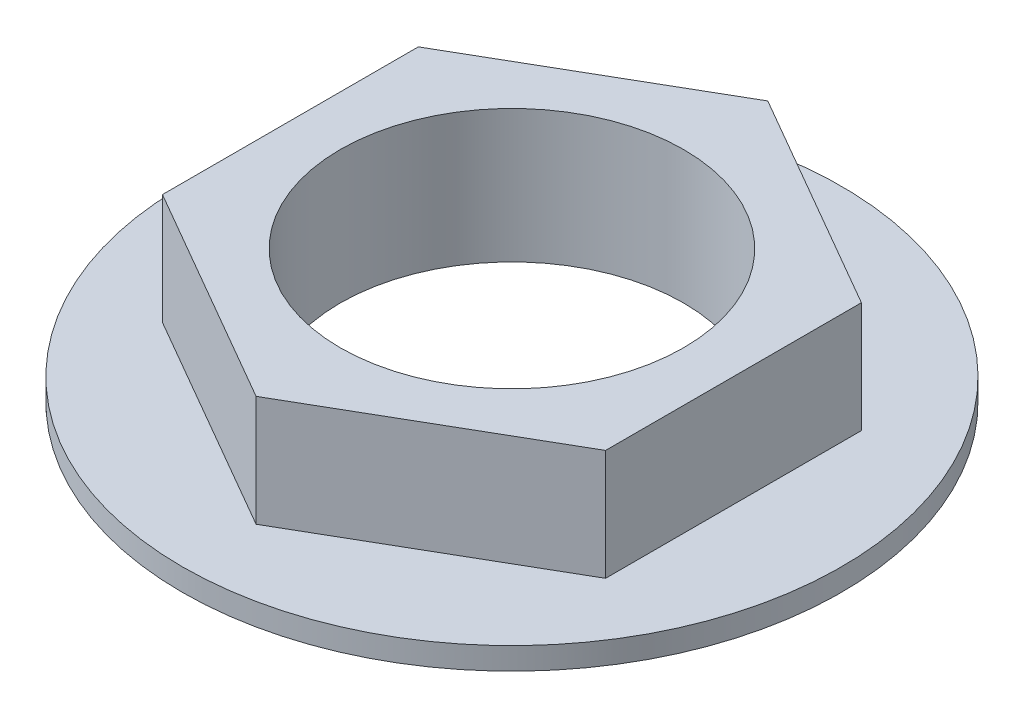
ISO-10303-21;
HEADER;
FILE_DESCRIPTION(('STEP AP214'),'2;1');
FILE_NAME('part.step','',(''),(''),'','','');
FILE_SCHEMA(('AUTOMOTIVE_DESIGN { 1 0 10303 214 1 1 1 1 }'));
ENDSEC;
DATA;
#1=APPLICATION_CONTEXT('core data for automotive mechanical design processes');
#2=APPLICATION_PROTOCOL_DEFINITION('international standard','automotive_design',2000,#1);
#3=PRODUCT_CONTEXT('',#1,'mechanical');
#4=PRODUCT('Part','Part','',(#3));
#5=PRODUCT_RELATED_PRODUCT_CATEGORY('part','',(#4));
#6=PRODUCT_DEFINITION_FORMATION('','',#4);
#7=PRODUCT_DEFINITION_CONTEXT('part definition',#1,'design');
#8=PRODUCT_DEFINITION('design','',#6,#7);
#9=PRODUCT_DEFINITION_SHAPE('','',#8);
#10=(LENGTH_UNIT() NAMED_UNIT(*) SI_UNIT(.MILLI.,.METRE.));
#11=(NAMED_UNIT(*) PLANE_ANGLE_UNIT() SI_UNIT($,.RADIAN.));
#12=(NAMED_UNIT(*) SI_UNIT($,.STERADIAN.) SOLID_ANGLE_UNIT());
#13=UNCERTAINTY_MEASURE_WITH_UNIT(LENGTH_MEASURE(1.E-05),#10,'distance_accuracy_value','');
#14=(GEOMETRIC_REPRESENTATION_CONTEXT(3) GLOBAL_UNCERTAINTY_ASSIGNED_CONTEXT((#13)) GLOBAL_UNIT_ASSIGNED_CONTEXT((#10,
#11,#12)) REPRESENTATION_CONTEXT('',''));
#15=CARTESIAN_POINT('',(0.,0.,0.));
#16=DIRECTION('',(0.,0.,1.));
#17=DIRECTION('',(1.,0.,0.));
#18=AXIS2_PLACEMENT_3D('',#15,#16,#17);
#19=CARTESIAN_POINT('',(0.,0.,0.));
#20=DIRECTION('',(0.,1.,0.));
#21=DIRECTION('',(0.,0.,1.));
#22=AXIS2_PLACEMENT_3D('',#19,#20,#21);
#23=PLANE('',#22);
#24=CARTESIAN_POINT('',(0.,0.,0.));
#25=DIRECTION('',(0.,1.,0.));
#26=DIRECTION('',(0.,0.,1.));
#27=AXIS2_PLACEMENT_3D('',#24,#25,#26);
#28=CIRCLE('',#27,5.95);
#29=CARTESIAN_POINT('',(0.,0.,5.95));
#30=VERTEX_POINT('',#29);
#31=EDGE_CURVE('E37',#30,#30,#28,.T.);
#32=ORIENTED_EDGE('',*,*,#31,.T.);
#33=EDGE_LOOP('',(#32));
#34=FACE_BOUND('',#33,.T.);
#35=DIRECTION('',(0.866025403784438,0.,0.5));
#36=VECTOR('',#35,1.);
#37=CARTESIAN_POINT('',(-4.,0.,2.3094010767585));
#38=LINE('',#37,#36);
#39=CARTESIAN_POINT('',(-4.,0.,2.3094010767585));
#40=VERTEX_POINT('',#39);
#41=CARTESIAN_POINT('',(0.,0.,4.61880215351701));
#42=VERTEX_POINT('',#41);
#43=EDGE_CURVE('E121',#40,#42,#38,.T.);
#44=ORIENTED_EDGE('',*,*,#43,.F.);
#45=DIRECTION('',(0.,0.,1.));
#46=VECTOR('',#45,1.);
#47=CARTESIAN_POINT('',(-4.,0.,-2.3094010767585));
#48=LINE('',#47,#46);
#49=CARTESIAN_POINT('',(-4.,0.,-2.3094010767585));
#50=VERTEX_POINT('',#49);
#51=EDGE_CURVE('E118',#50,#40,#48,.T.);
#52=ORIENTED_EDGE('',*,*,#51,.F.);
#53=DIRECTION('',(-0.866025403784439,0.,0.5));
#54=VECTOR('',#53,1.);
#55=CARTESIAN_POINT('',(0.,0.,-4.61880215351701));
#56=LINE('',#55,#54);
#57=CARTESIAN_POINT('',(0.,0.,-4.61880215351701));
#58=VERTEX_POINT('',#57);
#59=EDGE_CURVE('E76',#58,#50,#56,.T.);
#60=ORIENTED_EDGE('',*,*,#59,.F.);
#61=DIRECTION('',(-0.866025403784439,0.,-0.5));
#62=VECTOR('',#61,1.);
#63=CARTESIAN_POINT('',(4.,0.,-2.30940107675851));
#64=LINE('',#63,#62);
#65=CARTESIAN_POINT('',(4.,0.,-2.30940107675851));
#66=VERTEX_POINT('',#65);
#67=EDGE_CURVE('E127',#66,#58,#64,.T.);
#68=ORIENTED_EDGE('',*,*,#67,.F.);
#69=DIRECTION('',(0.,0.,-1.));
#70=VECTOR('',#69,1.);
#71=CARTESIAN_POINT('',(4.,0.,2.3094010767585));
#72=LINE('',#71,#70);
#73=CARTESIAN_POINT('',(4.,0.,2.3094010767585));
#74=VERTEX_POINT('',#73);
#75=EDGE_CURVE('E107',#74,#66,#72,.T.);
#76=ORIENTED_EDGE('',*,*,#75,.F.);
#77=DIRECTION('',(0.866025403784439,0.,-0.5));
#78=VECTOR('',#77,1.);
#79=CARTESIAN_POINT('',(0.,0.,4.61880215351701));
#80=LINE('',#79,#78);
#81=EDGE_CURVE('E124',#42,#74,#80,.T.);
#82=ORIENTED_EDGE('',*,*,#81,.F.);
#83=EDGE_LOOP('',(#44,#52,#60,#68,#76,#82));
#84=FACE_BOUND('',#83,.T.);
#85=ADVANCED_FACE('F33',(#34,#84),#23,.T.);
#86=CARTESIAN_POINT('',(0.,-0.4,0.));
#87=DIRECTION('',(0.,1.,0.));
#88=DIRECTION('',(0.,0.,1.));
#89=AXIS2_PLACEMENT_3D('',#86,#87,#88);
#90=CYLINDRICAL_SURFACE('',#89,5.95);
#91=CARTESIAN_POINT('',(0.,-0.4,0.));
#92=DIRECTION('',(0.,1.,0.));
#93=DIRECTION('',(0.,0.,1.));
#94=AXIS2_PLACEMENT_3D('',#91,#92,#93);
#95=CIRCLE('',#94,5.95);
#96=CARTESIAN_POINT('',(0.,-0.4,5.95));
#97=VERTEX_POINT('',#96);
#98=EDGE_CURVE('E11',#97,#97,#95,.T.);
#99=ORIENTED_EDGE('',*,*,#98,.T.);
#100=EDGE_LOOP('',(#99));
#101=FACE_BOUND('',#100,.T.);
#102=ORIENTED_EDGE('',*,*,#31,.F.);
#103=EDGE_LOOP('',(#102));
#104=FACE_BOUND('',#103,.T.);
#105=ADVANCED_FACE('F35',(#101,#104),#90,.T.);
#106=CARTESIAN_POINT('',(0.,-0.4,0.));
#107=DIRECTION('',(0.,1.,0.));
#108=DIRECTION('',(0.,0.,1.));
#109=AXIS2_PLACEMENT_3D('',#106,#107,#108);
#110=PLANE('',#109);
#111=CARTESIAN_POINT('',(0.,-0.4,0.));
#112=DIRECTION('',(0.,1.,0.));
#113=DIRECTION('',(0.,0.,1.));
#114=AXIS2_PLACEMENT_3D('',#111,#112,#113);
#115=CIRCLE('',#114,3.1);
#116=CARTESIAN_POINT('',(0.,-0.4,3.1));
#117=VERTEX_POINT('',#116);
#118=EDGE_CURVE('E139',#117,#117,#115,.T.);
#119=ORIENTED_EDGE('',*,*,#118,.T.);
#120=EDGE_LOOP('',(#119));
#121=FACE_BOUND('',#120,.T.);
#122=ORIENTED_EDGE('',*,*,#98,.F.);
#123=EDGE_LOOP('',(#122));
#124=FACE_BOUND('',#123,.T.);
#125=ADVANCED_FACE('F149',(#121,#124),#110,.F.);
#126=CARTESIAN_POINT('',(0.,-0.4,0.));
#127=DIRECTION('',(0.,1.,0.));
#128=DIRECTION('',(0.,0.,1.));
#129=AXIS2_PLACEMENT_3D('',#126,#127,#128);
#130=CYLINDRICAL_SURFACE('',#129,3.1);
#131=ORIENTED_EDGE('',*,*,#118,.F.);
#132=EDGE_LOOP('',(#131));
#133=FACE_BOUND('',#132,.T.);
#134=CARTESIAN_POINT('',(0.,2.,0.));
#135=DIRECTION('',(0.,1.,0.));
#136=DIRECTION('',(0.,0.,1.));
#137=AXIS2_PLACEMENT_3D('',#134,#135,#136);
#138=CIRCLE('',#137,3.1);
#139=CARTESIAN_POINT('',(0.,2.,3.1));
#140=VERTEX_POINT('',#139);
#141=EDGE_CURVE('E122',#140,#140,#138,.T.);
#142=ORIENTED_EDGE('',*,*,#141,.T.);
#143=EDGE_LOOP('',(#142));
#144=FACE_BOUND('',#143,.T.);
#145=ADVANCED_FACE('F155',(#133,#144),#130,.F.);
#146=CARTESIAN_POINT('',(0.,2.,0.));
#147=DIRECTION('',(0.,1.,0.));
#148=DIRECTION('',(0.,0.,1.));
#149=AXIS2_PLACEMENT_3D('',#146,#147,#148);
#150=PLANE('',#149);
#151=DIRECTION('',(0.,0.,1.));
#152=VECTOR('',#151,1.);
#153=CARTESIAN_POINT('',(-4.,2.,-2.3094010767585));
#154=LINE('',#153,#152);
#155=CARTESIAN_POINT('',(-4.,2.,-2.3094010767585));
#156=VERTEX_POINT('',#155);
#157=CARTESIAN_POINT('',(-4.,2.,2.3094010767585));
#158=VERTEX_POINT('',#157);
#159=EDGE_CURVE('E130',#156,#158,#154,.T.);
#160=ORIENTED_EDGE('',*,*,#159,.T.);
#161=DIRECTION('',(0.866025403784438,0.,0.5));
#162=VECTOR('',#161,1.);
#163=CARTESIAN_POINT('',(-4.,2.,2.3094010767585));
#164=LINE('',#163,#162);
#165=CARTESIAN_POINT('',(0.,2.,4.61880215351701));
#166=VERTEX_POINT('',#165);
#167=EDGE_CURVE('E84',#158,#166,#164,.T.);
#168=ORIENTED_EDGE('',*,*,#167,.T.);
#169=DIRECTION('',(0.866025403784439,0.,-0.5));
#170=VECTOR('',#169,1.);
#171=CARTESIAN_POINT('',(0.,2.,4.61880215351701));
#172=LINE('',#171,#170);
#173=CARTESIAN_POINT('',(4.,2.,2.3094010767585));
#174=VERTEX_POINT('',#173);
#175=EDGE_CURVE('E98',#166,#174,#172,.T.);
#176=ORIENTED_EDGE('',*,*,#175,.T.);
#177=DIRECTION('',(0.,0.,-1.));
#178=VECTOR('',#177,1.);
#179=CARTESIAN_POINT('',(4.,2.,2.3094010767585));
#180=LINE('',#179,#178);
#181=CARTESIAN_POINT('',(4.,2.,-2.30940107675851));
#182=VERTEX_POINT('',#181);
#183=EDGE_CURVE('E91',#174,#182,#180,.T.);
#184=ORIENTED_EDGE('',*,*,#183,.T.);
#185=DIRECTION('',(-0.866025403784439,0.,-0.5));
#186=VECTOR('',#185,1.);
#187=CARTESIAN_POINT('',(4.,2.,-2.30940107675851));
#188=LINE('',#187,#186);
#189=CARTESIAN_POINT('',(0.,2.,-4.61880215351701));
#190=VERTEX_POINT('',#189);
#191=EDGE_CURVE('E96',#182,#190,#188,.T.);
#192=ORIENTED_EDGE('',*,*,#191,.T.);
#193=DIRECTION('',(-0.866025403784439,0.,0.5));
#194=VECTOR('',#193,1.);
#195=CARTESIAN_POINT('',(0.,2.,-4.61880215351701));
#196=LINE('',#195,#194);
#197=EDGE_CURVE('E56',#190,#156,#196,.T.);
#198=ORIENTED_EDGE('',*,*,#197,.T.);
#199=EDGE_LOOP('',(#160,#168,#176,#184,#192,#198));
#200=FACE_BOUND('',#199,.T.);
#201=ORIENTED_EDGE('',*,*,#141,.F.);
#202=EDGE_LOOP('',(#201));
#203=FACE_BOUND('',#202,.T.);
#204=ADVANCED_FACE('F93',(#200,#203),#150,.T.);
#205=CARTESIAN_POINT('',(-4.,2.,-2.3094010767585));
#206=DIRECTION('',(1.,0.,0.));
#207=DIRECTION('',(0.,0.,-1.));
#208=AXIS2_PLACEMENT_3D('',#205,#206,#207);
#209=PLANE('',#208);
#210=ORIENTED_EDGE('',*,*,#51,.T.);
#211=DIRECTION('',(0.,-1.,0.));
#212=VECTOR('',#211,1.);
#213=CARTESIAN_POINT('',(-4.,2.,2.3094010767585));
#214=LINE('',#213,#212);
#215=EDGE_CURVE('E137',#158,#40,#214,.T.);
#216=ORIENTED_EDGE('',*,*,#215,.F.);
#217=ORIENTED_EDGE('',*,*,#159,.F.);
#218=DIRECTION('',(0.,-1.,0.));
#219=VECTOR('',#218,1.);
#220=CARTESIAN_POINT('',(-4.,2.,-2.3094010767585));
#221=LINE('',#220,#219);
#222=EDGE_CURVE('E114',#156,#50,#221,.T.);
#223=ORIENTED_EDGE('',*,*,#222,.T.);
#224=EDGE_LOOP('',(#210,#216,#217,#223));
#225=FACE_BOUND('',#224,.T.);
#226=ADVANCED_FACE('F165',(#225),#209,.F.);
#227=CARTESIAN_POINT('',(-4.,2.,2.3094010767585));
#228=DIRECTION('',(0.5,0.,-0.866025403784439));
#229=DIRECTION('',(-0.866025403784438,0.,-0.5));
#230=AXIS2_PLACEMENT_3D('',#227,#228,#229);
#231=PLANE('',#230);
#232=ORIENTED_EDGE('',*,*,#43,.T.);
#233=DIRECTION('',(0.,-1.,0.));
#234=VECTOR('',#233,1.);
#235=CARTESIAN_POINT('',(0.,2.,4.61880215351701));
#236=LINE('',#235,#234);
#237=EDGE_CURVE('E134',#166,#42,#236,.T.);
#238=ORIENTED_EDGE('',*,*,#237,.F.);
#239=ORIENTED_EDGE('',*,*,#167,.F.);
#240=ORIENTED_EDGE('',*,*,#215,.T.);
#241=EDGE_LOOP('',(#232,#238,#239,#240));
#242=FACE_BOUND('',#241,.T.);
#243=ADVANCED_FACE('F168',(#242),#231,.F.);
#244=CARTESIAN_POINT('',(0.,2.,4.61880215351701));
#245=DIRECTION('',(-0.5,0.,-0.866025403784438));
#246=DIRECTION('',(-0.866025403784439,0.,0.5));
#247=AXIS2_PLACEMENT_3D('',#244,#245,#246);
#248=PLANE('',#247);
#249=ORIENTED_EDGE('',*,*,#81,.T.);
#250=DIRECTION('',(0.,-1.,0.));
#251=VECTOR('',#250,1.);
#252=CARTESIAN_POINT('',(4.,2.,2.3094010767585));
#253=LINE('',#252,#251);
#254=EDGE_CURVE('E110',#174,#74,#253,.T.);
#255=ORIENTED_EDGE('',*,*,#254,.F.);
#256=ORIENTED_EDGE('',*,*,#175,.F.);
#257=ORIENTED_EDGE('',*,*,#237,.T.);
#258=EDGE_LOOP('',(#249,#255,#256,#257));
#259=FACE_BOUND('',#258,.T.);
#260=ADVANCED_FACE('F172',(#259),#248,.F.);
#261=CARTESIAN_POINT('',(4.,2.,2.3094010767585));
#262=DIRECTION('',(-1.,0.,0.));
#263=DIRECTION('',(0.,0.,1.));
#264=AXIS2_PLACEMENT_3D('',#261,#262,#263);
#265=PLANE('',#264);
#266=ORIENTED_EDGE('',*,*,#75,.T.);
#267=DIRECTION('',(0.,-1.,0.));
#268=VECTOR('',#267,1.);
#269=CARTESIAN_POINT('',(4.,2.,-2.30940107675851));
#270=LINE('',#269,#268);
#271=EDGE_CURVE('E104',#182,#66,#270,.T.);
#272=ORIENTED_EDGE('',*,*,#271,.F.);
#273=ORIENTED_EDGE('',*,*,#183,.F.);
#274=ORIENTED_EDGE('',*,*,#254,.T.);
#275=EDGE_LOOP('',(#266,#272,#273,#274));
#276=FACE_BOUND('',#275,.T.);
#277=ADVANCED_FACE('F105',(#276),#265,.F.);
#278=CARTESIAN_POINT('',(4.,2.,-2.30940107675851));
#279=DIRECTION('',(-0.5,0.,0.866025403784439));
#280=DIRECTION('',(0.866025403784439,0.,0.5));
#281=AXIS2_PLACEMENT_3D('',#278,#279,#280);
#282=PLANE('',#281);
#283=ORIENTED_EDGE('',*,*,#67,.T.);
#284=DIRECTION('',(0.,-1.,0.));
#285=VECTOR('',#284,1.);
#286=CARTESIAN_POINT('',(0.,2.,-4.61880215351701));
#287=LINE('',#286,#285);
#288=EDGE_CURVE('E48',#190,#58,#287,.T.);
#289=ORIENTED_EDGE('',*,*,#288,.F.);
#290=ORIENTED_EDGE('',*,*,#191,.F.);
#291=ORIENTED_EDGE('',*,*,#271,.T.);
#292=EDGE_LOOP('',(#283,#289,#290,#291));
#293=FACE_BOUND('',#292,.T.);
#294=ADVANCED_FACE('F112',(#293),#282,.F.);
#295=CARTESIAN_POINT('',(0.,2.,-4.61880215351701));
#296=DIRECTION('',(0.5,0.,0.866025403784439));
#297=DIRECTION('',(0.866025403784439,0.,-0.5));
#298=AXIS2_PLACEMENT_3D('',#295,#296,#297);
#299=PLANE('',#298);
#300=ORIENTED_EDGE('',*,*,#59,.T.);
#301=ORIENTED_EDGE('',*,*,#222,.F.);
#302=ORIENTED_EDGE('',*,*,#197,.F.);
#303=ORIENTED_EDGE('',*,*,#288,.T.);
#304=EDGE_LOOP('',(#300,#301,#302,#303));
#305=FACE_BOUND('',#304,.T.);
#306=ADVANCED_FACE('F180',(#305),#299,.F.);
#307=CLOSED_SHELL('',(#85,#105,#125,#145,#204,#226,#243,#260,#277,#294,#306));
#308=MANIFOLD_SOLID_BREP('B2',#307);
#309=ADVANCED_BREP_SHAPE_REPRESENTATION('',(#18,#308),#14);
#310=SHAPE_DEFINITION_REPRESENTATION(#9,#309);
ENDSEC;
END-ISO-10303-21;
